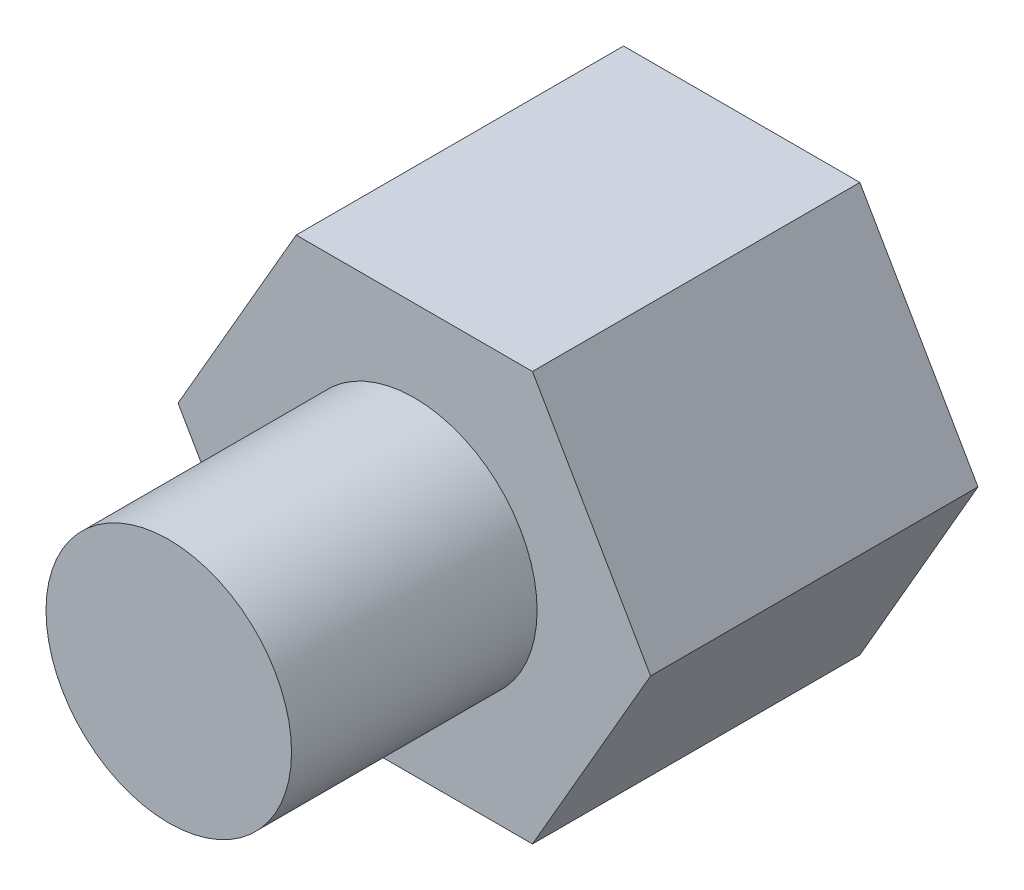
ISO-10303-21;
HEADER;
FILE_DESCRIPTION(('STEP AP214'),'2;1');
FILE_NAME('part.step','',(''),(''),'','','');
FILE_SCHEMA(('AUTOMOTIVE_DESIGN { 1 0 10303 214 1 1 1 1 }'));
ENDSEC;
DATA;
#1=APPLICATION_CONTEXT('core data for automotive mechanical design processes');
#2=APPLICATION_PROTOCOL_DEFINITION('international standard','automotive_design',2000,#1);
#3=PRODUCT_CONTEXT('',#1,'mechanical');
#4=PRODUCT('Part','Part','',(#3));
#5=PRODUCT_RELATED_PRODUCT_CATEGORY('part','',(#4));
#6=PRODUCT_DEFINITION_FORMATION('','',#4);
#7=PRODUCT_DEFINITION_CONTEXT('part definition',#1,'design');
#8=PRODUCT_DEFINITION('design','',#6,#7);
#9=PRODUCT_DEFINITION_SHAPE('','',#8);
#10=(LENGTH_UNIT() NAMED_UNIT(*) SI_UNIT(.MILLI.,.METRE.));
#11=(NAMED_UNIT(*) PLANE_ANGLE_UNIT() SI_UNIT($,.RADIAN.));
#12=(NAMED_UNIT(*) SI_UNIT($,.STERADIAN.) SOLID_ANGLE_UNIT());
#13=UNCERTAINTY_MEASURE_WITH_UNIT(LENGTH_MEASURE(1.E-05),#10,'distance_accuracy_value','');
#14=(GEOMETRIC_REPRESENTATION_CONTEXT(3) GLOBAL_UNCERTAINTY_ASSIGNED_CONTEXT((#13)) GLOBAL_UNIT_ASSIGNED_CONTEXT((#10,
#11,#12)) REPRESENTATION_CONTEXT('',''));
#15=CARTESIAN_POINT('',(0.,0.,0.));
#16=DIRECTION('',(0.,0.,1.));
#17=DIRECTION('',(1.,0.,0.));
#18=AXIS2_PLACEMENT_3D('',#15,#16,#17);
#19=CARTESIAN_POINT('',(1.44337567297409,-2.49999999999997,4.));
#20=DIRECTION('',(-0.866025403784442,0.499999999999995,0.));
#21=DIRECTION('',(-0.499999999999995,-0.866025403784442,0.));
#22=AXIS2_PLACEMENT_3D('',#19,#20,#21);
#23=PLANE('',#22);
#24=DIRECTION('',(0.499999999999995,0.866025403784442,0.));
#25=VECTOR('',#24,1.);
#26=CARTESIAN_POINT('',(1.44337567297409,-2.49999999999997,0.));
#27=LINE('',#26,#25);
#28=CARTESIAN_POINT('',(1.44337567297409,-2.49999999999997,0.));
#29=VERTEX_POINT('',#28);
#30=CARTESIAN_POINT('',(2.88675134594812,0.,0.));
#31=VERTEX_POINT('',#30);
#32=EDGE_CURVE('E119',#29,#31,#27,.T.);
#33=ORIENTED_EDGE('',*,*,#32,.T.);
#34=DIRECTION('',(0.,0.,-1.));
#35=VECTOR('',#34,1.);
#36=CARTESIAN_POINT('',(2.88675134594812,0.,4.));
#37=LINE('',#36,#35);
#38=CARTESIAN_POINT('',(2.88675134594812,0.,4.));
#39=VERTEX_POINT('',#38);
#40=EDGE_CURVE('E36',#39,#31,#37,.T.);
#41=ORIENTED_EDGE('',*,*,#40,.F.);
#42=DIRECTION('',(0.499999999999995,0.866025403784442,0.));
#43=VECTOR('',#42,1.);
#44=CARTESIAN_POINT('',(1.44337567297409,-2.49999999999997,4.));
#45=LINE('',#44,#43);
#46=CARTESIAN_POINT('',(1.44337567297409,-2.49999999999997,4.));
#47=VERTEX_POINT('',#46);
#48=EDGE_CURVE('E130',#47,#39,#45,.T.);
#49=ORIENTED_EDGE('',*,*,#48,.F.);
#50=DIRECTION('',(0.,0.,-1.));
#51=VECTOR('',#50,1.);
#52=CARTESIAN_POINT('',(1.44337567297409,-2.49999999999997,4.));
#53=LINE('',#52,#51);
#54=EDGE_CURVE('E115',#47,#29,#53,.T.);
#55=ORIENTED_EDGE('',*,*,#54,.T.);
#56=EDGE_LOOP('',(#33,#41,#49,#55));
#57=FACE_BOUND('',#56,.T.);
#58=ADVANCED_FACE('F33',(#57),#23,.F.);
#59=CARTESIAN_POINT('',(2.88675134594812,0.,4.));
#60=DIRECTION('',(-0.866025403784438,-0.500000000000001,0.));
#61=DIRECTION('',(0.500000000000001,-0.866025403784438,0.));
#62=AXIS2_PLACEMENT_3D('',#59,#60,#61);
#63=PLANE('',#62);
#64=DIRECTION('',(-0.500000000000001,0.866025403784438,0.));
#65=VECTOR('',#64,1.);
#66=CARTESIAN_POINT('',(2.88675134594812,0.,0.));
#67=LINE('',#66,#65);
#68=CARTESIAN_POINT('',(1.44337567297405,2.5,0.));
#69=VERTEX_POINT('',#68);
#70=EDGE_CURVE('E122',#31,#69,#67,.T.);
#71=ORIENTED_EDGE('',*,*,#70,.T.);
#72=DIRECTION('',(0.,0.,-1.));
#73=VECTOR('',#72,1.);
#74=CARTESIAN_POINT('',(1.44337567297405,2.5,4.));
#75=LINE('',#74,#73);
#76=CARTESIAN_POINT('',(1.44337567297405,2.5,4.));
#77=VERTEX_POINT('',#76);
#78=EDGE_CURVE('E133',#77,#69,#75,.T.);
#79=ORIENTED_EDGE('',*,*,#78,.F.);
#80=DIRECTION('',(-0.500000000000001,0.866025403784438,0.));
#81=VECTOR('',#80,1.);
#82=CARTESIAN_POINT('',(2.88675134594812,0.,4.));
#83=LINE('',#82,#81);
#84=EDGE_CURVE('E88',#39,#77,#83,.T.);
#85=ORIENTED_EDGE('',*,*,#84,.F.);
#86=ORIENTED_EDGE('',*,*,#40,.T.);
#87=EDGE_LOOP('',(#71,#79,#85,#86));
#88=FACE_BOUND('',#87,.T.);
#89=ADVANCED_FACE('F138',(#88),#63,.F.);
#90=CARTESIAN_POINT('',(1.44337567297405,2.5,4.));
#91=DIRECTION('',(0.,-1.,0.));
#92=DIRECTION('',(1.,0.,0.));
#93=AXIS2_PLACEMENT_3D('',#90,#91,#92);
#94=PLANE('',#93);
#95=DIRECTION('',(-1.,0.,0.));
#96=VECTOR('',#95,1.);
#97=CARTESIAN_POINT('',(1.44337567297405,2.5,0.));
#98=LINE('',#97,#96);
#99=CARTESIAN_POINT('',(-1.44337567297407,2.49999999999998,0.));
#100=VERTEX_POINT('',#99);
#101=EDGE_CURVE('E125',#69,#100,#98,.T.);
#102=ORIENTED_EDGE('',*,*,#101,.T.);
#103=DIRECTION('',(0.,0.,-1.));
#104=VECTOR('',#103,1.);
#105=CARTESIAN_POINT('',(-1.44337567297407,2.49999999999998,4.));
#106=LINE('',#105,#104);
#107=CARTESIAN_POINT('',(-1.44337567297407,2.49999999999998,4.));
#108=VERTEX_POINT('',#107);
#109=EDGE_CURVE('E110',#108,#100,#106,.T.);
#110=ORIENTED_EDGE('',*,*,#109,.F.);
#111=DIRECTION('',(-1.,0.,0.));
#112=VECTOR('',#111,1.);
#113=CARTESIAN_POINT('',(1.44337567297405,2.5,4.));
#114=LINE('',#113,#112);
#115=EDGE_CURVE('E101',#77,#108,#114,.T.);
#116=ORIENTED_EDGE('',*,*,#115,.F.);
#117=ORIENTED_EDGE('',*,*,#78,.T.);
#118=EDGE_LOOP('',(#102,#110,#116,#117));
#119=FACE_BOUND('',#118,.T.);
#120=ADVANCED_FACE('F144',(#119),#94,.F.);
#121=CARTESIAN_POINT('',(-1.44337567297407,2.49999999999998,4.));
#122=DIRECTION('',(0.866025403784442,-0.499999999999995,0.));
#123=DIRECTION('',(0.499999999999995,0.866025403784442,0.));
#124=AXIS2_PLACEMENT_3D('',#121,#122,#123);
#125=PLANE('',#124);
#126=DIRECTION('',(-0.499999999999995,-0.866025403784442,0.));
#127=VECTOR('',#126,1.);
#128=CARTESIAN_POINT('',(-1.44337567297407,2.49999999999998,0.));
#129=LINE('',#128,#127);
#130=CARTESIAN_POINT('',(-2.88675134594812,0.,0.));
#131=VERTEX_POINT('',#130);
#132=EDGE_CURVE('E109',#100,#131,#129,.T.);
#133=ORIENTED_EDGE('',*,*,#132,.T.);
#134=DIRECTION('',(0.,0.,-1.));
#135=VECTOR('',#134,1.);
#136=CARTESIAN_POINT('',(-2.88675134594812,0.,4.));
#137=LINE('',#136,#135);
#138=CARTESIAN_POINT('',(-2.88675134594812,0.,4.));
#139=VERTEX_POINT('',#138);
#140=EDGE_CURVE('E106',#139,#131,#137,.T.);
#141=ORIENTED_EDGE('',*,*,#140,.F.);
#142=DIRECTION('',(-0.499999999999995,-0.866025403784442,0.));
#143=VECTOR('',#142,1.);
#144=CARTESIAN_POINT('',(-1.44337567297407,2.49999999999998,4.));
#145=LINE('',#144,#143);
#146=EDGE_CURVE('E95',#108,#139,#145,.T.);
#147=ORIENTED_EDGE('',*,*,#146,.F.);
#148=ORIENTED_EDGE('',*,*,#109,.T.);
#149=EDGE_LOOP('',(#133,#141,#147,#148));
#150=FACE_BOUND('',#149,.T.);
#151=ADVANCED_FACE('F107',(#150),#125,.F.);
#152=CARTESIAN_POINT('',(-2.88675134594812,0.,4.));
#153=DIRECTION('',(0.866025403784434,0.500000000000007,0.));
#154=DIRECTION('',(-0.500000000000007,0.866025403784435,0.));
#155=AXIS2_PLACEMENT_3D('',#152,#153,#154);
#156=PLANE('',#155);
#157=DIRECTION('',(0.500000000000007,-0.866025403784435,0.));
#158=VECTOR('',#157,1.);
#159=CARTESIAN_POINT('',(-2.88675134594812,0.,0.));
#160=LINE('',#159,#158);
#161=CARTESIAN_POINT('',(-1.44337567297404,-2.5,0.));
#162=VERTEX_POINT('',#161);
#163=EDGE_CURVE('E73',#131,#162,#160,.T.);
#164=ORIENTED_EDGE('',*,*,#163,.T.);
#165=DIRECTION('',(0.,0.,-1.));
#166=VECTOR('',#165,1.);
#167=CARTESIAN_POINT('',(-1.44337567297404,-2.5,4.));
#168=LINE('',#167,#166);
#169=CARTESIAN_POINT('',(-1.44337567297404,-2.5,4.));
#170=VERTEX_POINT('',#169);
#171=EDGE_CURVE('E111',#170,#162,#168,.T.);
#172=ORIENTED_EDGE('',*,*,#171,.F.);
#173=DIRECTION('',(0.500000000000007,-0.866025403784435,0.));
#174=VECTOR('',#173,1.);
#175=CARTESIAN_POINT('',(-2.88675134594812,0.,4.));
#176=LINE('',#175,#174);
#177=EDGE_CURVE('E99',#139,#170,#176,.T.);
#178=ORIENTED_EDGE('',*,*,#177,.F.);
#179=ORIENTED_EDGE('',*,*,#140,.T.);
#180=EDGE_LOOP('',(#164,#172,#178,#179));
#181=FACE_BOUND('',#180,.T.);
#182=ADVANCED_FACE('F113',(#181),#156,.F.);
#183=CARTESIAN_POINT('',(-1.44337567297404,-2.5,4.));
#184=DIRECTION('',(0.,1.,0.));
#185=DIRECTION('',(-1.,0.,0.));
#186=AXIS2_PLACEMENT_3D('',#183,#184,#185);
#187=PLANE('',#186);
#188=DIRECTION('',(1.,0.,0.));
#189=VECTOR('',#188,1.);
#190=CARTESIAN_POINT('',(-1.44337567297404,-2.5,0.));
#191=LINE('',#190,#189);
#192=EDGE_CURVE('E79',#162,#29,#191,.T.);
#193=ORIENTED_EDGE('',*,*,#192,.T.);
#194=ORIENTED_EDGE('',*,*,#54,.F.);
#195=DIRECTION('',(1.,0.,0.));
#196=VECTOR('',#195,1.);
#197=CARTESIAN_POINT('',(-1.44337567297404,-2.5,4.));
#198=LINE('',#197,#196);
#199=EDGE_CURVE('E50',#170,#47,#198,.T.);
#200=ORIENTED_EDGE('',*,*,#199,.F.);
#201=ORIENTED_EDGE('',*,*,#171,.T.);
#202=EDGE_LOOP('',(#193,#194,#200,#201));
#203=FACE_BOUND('',#202,.T.);
#204=ADVANCED_FACE('F167',(#203),#187,.F.);
#205=CARTESIAN_POINT('',(0.,0.,4.));
#206=DIRECTION('',(0.,0.,1.));
#207=DIRECTION('',(1.,0.,0.));
#208=AXIS2_PLACEMENT_3D('',#205,#206,#207);
#209=PLANE('',#208);
#210=CARTESIAN_POINT('',(0.,0.,4.));
#211=DIRECTION('',(0.,0.,1.));
#212=DIRECTION('',(1.,0.,0.));
#213=AXIS2_PLACEMENT_3D('',#210,#211,#212);
#214=CIRCLE('',#213,1.5);
#215=CARTESIAN_POINT('',(1.5,0.,4.));
#216=VERTEX_POINT('',#215);
#217=EDGE_CURVE('E11',#216,#216,#214,.T.);
#218=ORIENTED_EDGE('',*,*,#217,.F.);
#219=EDGE_LOOP('',(#218));
#220=FACE_BOUND('',#219,.T.);
#221=ORIENTED_EDGE('',*,*,#48,.T.);
#222=ORIENTED_EDGE('',*,*,#84,.T.);
#223=ORIENTED_EDGE('',*,*,#115,.T.);
#224=ORIENTED_EDGE('',*,*,#146,.T.);
#225=ORIENTED_EDGE('',*,*,#177,.T.);
#226=ORIENTED_EDGE('',*,*,#199,.T.);
#227=EDGE_LOOP('',(#221,#222,#223,#224,#225,#226));
#228=FACE_BOUND('',#227,.T.);
#229=ADVANCED_FACE('F97',(#220,#228),#209,.T.);
#230=CARTESIAN_POINT('',(0.,0.,0.));
#231=DIRECTION('',(0.,0.,1.));
#232=DIRECTION('',(1.,0.,0.));
#233=AXIS2_PLACEMENT_3D('',#230,#231,#232);
#234=PLANE('',#233);
#235=CARTESIAN_POINT('',(0.,0.,0.));
#236=DIRECTION('',(0.,0.,-1.));
#237=DIRECTION('',(-1.,0.,0.));
#238=AXIS2_PLACEMENT_3D('',#235,#236,#237);
#239=CIRCLE('',#238,1.5);
#240=CARTESIAN_POINT('',(-1.5,0.,0.));
#241=VERTEX_POINT('',#240);
#242=EDGE_CURVE('E148',#241,#241,#239,.T.);
#243=ORIENTED_EDGE('',*,*,#242,.F.);
#244=EDGE_LOOP('',(#243));
#245=FACE_BOUND('',#244,.T.);
#246=ORIENTED_EDGE('',*,*,#32,.F.);
#247=ORIENTED_EDGE('',*,*,#192,.F.);
#248=ORIENTED_EDGE('',*,*,#163,.F.);
#249=ORIENTED_EDGE('',*,*,#132,.F.);
#250=ORIENTED_EDGE('',*,*,#101,.F.);
#251=ORIENTED_EDGE('',*,*,#70,.F.);
#252=EDGE_LOOP('',(#246,#247,#248,#249,#250,#251));
#253=FACE_BOUND('',#252,.T.);
#254=ADVANCED_FACE('F143',(#245,#253),#234,.F.);
#255=CARTESIAN_POINT('',(0.,0.,3.));
#256=DIRECTION('',(0.,0.,-1.));
#257=DIRECTION('',(-1.,0.,0.));
#258=AXIS2_PLACEMENT_3D('',#255,#256,#257);
#259=CYLINDRICAL_SURFACE('',#258,1.5);
#260=CARTESIAN_POINT('',(0.,0.,3.));
#261=DIRECTION('',(0.,0.,-1.));
#262=DIRECTION('',(-1.,0.,0.));
#263=AXIS2_PLACEMENT_3D('',#260,#261,#262);
#264=CIRCLE('',#263,1.5);
#265=CARTESIAN_POINT('',(-1.5,0.,3.));
#266=VERTEX_POINT('',#265);
#267=EDGE_CURVE('E123',#266,#266,#264,.T.);
#268=ORIENTED_EDGE('',*,*,#267,.F.);
#269=EDGE_LOOP('',(#268));
#270=FACE_BOUND('',#269,.T.);
#271=ORIENTED_EDGE('',*,*,#242,.T.);
#272=EDGE_LOOP('',(#271));
#273=FACE_BOUND('',#272,.T.);
#274=ADVANCED_FACE('F173',(#270,#273),#259,.F.);
#275=CARTESIAN_POINT('',(0.,0.,3.));
#276=DIRECTION('',(0.,0.,-1.));
#277=DIRECTION('',(-1.,0.,0.));
#278=AXIS2_PLACEMENT_3D('',#275,#276,#277);
#279=PLANE('',#278);
#280=ORIENTED_EDGE('',*,*,#267,.T.);
#281=EDGE_LOOP('',(#280));
#282=FACE_BOUND('',#281,.T.);
#283=ADVANCED_FACE('F162',(#282),#279,.T.);
#284=CARTESIAN_POINT('',(0.,0.,7.));
#285=DIRECTION('',(0.,0.,-1.));
#286=DIRECTION('',(-1.,0.,0.));
#287=AXIS2_PLACEMENT_3D('',#284,#285,#286);
#288=CYLINDRICAL_SURFACE('',#287,1.5);
#289=CARTESIAN_POINT('',(0.,0.,7.));
#290=DIRECTION('',(0.,0.,1.));
#291=DIRECTION('',(1.,0.,0.));
#292=AXIS2_PLACEMENT_3D('',#289,#290,#291);
#293=CIRCLE('',#292,1.5);
#294=CARTESIAN_POINT('',(1.5,0.,7.));
#295=VERTEX_POINT('',#294);
#296=EDGE_CURVE('E151',#295,#295,#293,.T.);
#297=ORIENTED_EDGE('',*,*,#296,.F.);
#298=EDGE_LOOP('',(#297));
#299=FACE_BOUND('',#298,.T.);
#300=ORIENTED_EDGE('',*,*,#217,.T.);
#301=EDGE_LOOP('',(#300));
#302=FACE_BOUND('',#301,.T.);
#303=ADVANCED_FACE('F159',(#299,#302),#288,.T.);
#304=CARTESIAN_POINT('',(0.,0.,7.));
#305=DIRECTION('',(0.,0.,1.));
#306=DIRECTION('',(1.,0.,0.));
#307=AXIS2_PLACEMENT_3D('',#304,#305,#306);
#308=PLANE('',#307);
#309=ORIENTED_EDGE('',*,*,#296,.T.);
#310=EDGE_LOOP('',(#309));
#311=FACE_BOUND('',#310,.T.);
#312=ADVANCED_FACE('F157',(#311),#308,.T.);
#313=CLOSED_SHELL('',(#58,#89,#120,#151,#182,#204,#229,#254,#274,#283,#303,#312));
#314=MANIFOLD_SOLID_BREP('B2',#313);
#315=ADVANCED_BREP_SHAPE_REPRESENTATION('',(#18,#314),#14);
#316=SHAPE_DEFINITION_REPRESENTATION(#9,#315);
ENDSEC;
END-ISO-10303-21;
